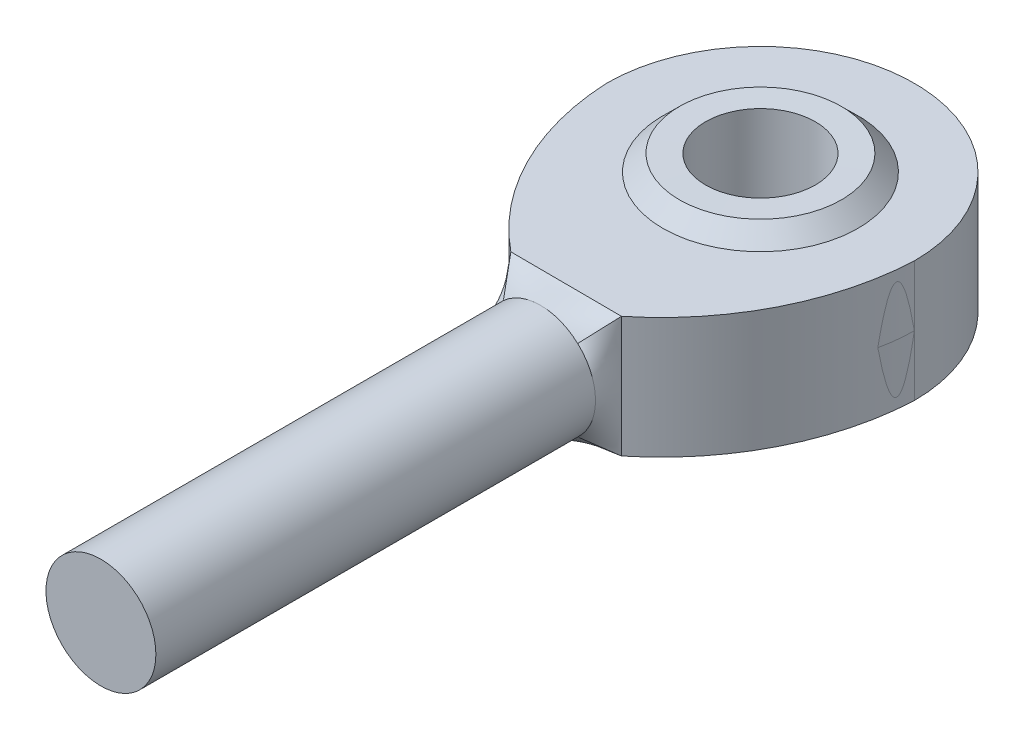
ISO-10303-21;
HEADER;
FILE_DESCRIPTION(('STEP AP214'),'2;1');
FILE_NAME('part.step','',(''),(''),'','','');
FILE_SCHEMA(('AUTOMOTIVE_DESIGN { 1 0 10303 214 1 1 1 1 }'));
ENDSEC;
DATA;
#1=APPLICATION_CONTEXT('core data for automotive mechanical design processes');
#2=APPLICATION_PROTOCOL_DEFINITION('international standard','automotive_design',2000,#1);
#3=PRODUCT_CONTEXT('',#1,'mechanical');
#4=PRODUCT('Part','Part','',(#3));
#5=PRODUCT_RELATED_PRODUCT_CATEGORY('part','',(#4));
#6=PRODUCT_DEFINITION_FORMATION('','',#4);
#7=PRODUCT_DEFINITION_CONTEXT('part definition',#1,'design');
#8=PRODUCT_DEFINITION('design','',#6,#7);
#9=PRODUCT_DEFINITION_SHAPE('','',#8);
#10=(LENGTH_UNIT() NAMED_UNIT(*) SI_UNIT(.MILLI.,.METRE.));
#11=(NAMED_UNIT(*) PLANE_ANGLE_UNIT() SI_UNIT($,.RADIAN.));
#12=(NAMED_UNIT(*) SI_UNIT($,.STERADIAN.) SOLID_ANGLE_UNIT());
#13=UNCERTAINTY_MEASURE_WITH_UNIT(LENGTH_MEASURE(1.E-05),#10,'distance_accuracy_value','');
#14=(GEOMETRIC_REPRESENTATION_CONTEXT(3) GLOBAL_UNCERTAINTY_ASSIGNED_CONTEXT((#13)) GLOBAL_UNIT_ASSIGNED_CONTEXT((#10,
#11,#12)) REPRESENTATION_CONTEXT('',''));
#15=CARTESIAN_POINT('',(0.,0.,0.));
#16=DIRECTION('',(0.,0.,1.));
#17=DIRECTION('',(1.,0.,0.));
#18=AXIS2_PLACEMENT_3D('',#15,#16,#17);
#19=CARTESIAN_POINT('',(0.,-1.16892371536852,0.));
#20=DIRECTION('',(0.,-1.,0.));
#21=DIRECTION('',(0.,0.,-1.));
#22=AXIS2_PLACEMENT_3D('',#19,#20,#21);
#23=CONICAL_SURFACE('',#22,3.92044010300914,1.56325607343749);
#24=CARTESIAN_POINT('',(0.,-1.18345436205042,0.));
#25=DIRECTION('',(0.,1.,0.));
#26=DIRECTION('',(0.,0.,1.));
#27=AXIS2_PLACEMENT_3D('',#24,#25,#26);
#28=CIRCLE('',#27,5.84748029783002);
#29=CARTESIAN_POINT('',(0.,-1.18345436205042,5.84748029783002));
#30=VERTEX_POINT('',#29);
#31=EDGE_CURVE('E372',#30,#30,#28,.T.);
#32=ORIENTED_EDGE('',*,*,#31,.F.);
#33=EDGE_LOOP('',(#32));
#34=FACE_BOUND('',#33,.T.);
#35=CARTESIAN_POINT('',(0.,-1.16924010961895,0.));
#36=DIRECTION('',(0.,-1.,0.));
#37=DIRECTION('',(0.,0.,-1.));
#38=AXIS2_PLACEMENT_3D('',#35,#36,#37);
#39=CIRCLE('',#38,3.9624);
#40=CARTESIAN_POINT('',(0.,-1.16924010961895,-3.9624));
#41=VERTEX_POINT('',#40);
#42=EDGE_CURVE('E164',#41,#41,#39,.T.);
#43=ORIENTED_EDGE('',*,*,#42,.F.);
#44=EDGE_LOOP('',(#43));
#45=FACE_BOUND('',#44,.T.);
#46=ADVANCED_FACE('F62',(#34,#45),#23,.F.);
#47=CARTESIAN_POINT('',(0.,9.90652371536852,0.));
#48=DIRECTION('',(0.,1.,0.));
#49=DIRECTION('',(0.,0.,1.));
#50=AXIS2_PLACEMENT_3D('',#47,#48,#49);
#51=CONICAL_SURFACE('',#50,3.92044010300914,1.56325607343749);
#52=CARTESIAN_POINT('',(0.,9.92105436205042,0.));
#53=DIRECTION('',(0.,1.,0.));
#54=DIRECTION('',(0.,0.,1.));
#55=AXIS2_PLACEMENT_3D('',#52,#53,#54);
#56=CIRCLE('',#55,5.84748029783002);
#57=CARTESIAN_POINT('',(0.,9.92105436205042,5.84748029783002));
#58=VERTEX_POINT('',#57);
#59=EDGE_CURVE('E370',#58,#58,#56,.T.);
#60=ORIENTED_EDGE('',*,*,#59,.T.);
#61=EDGE_LOOP('',(#60));
#62=FACE_BOUND('',#61,.T.);
#63=CARTESIAN_POINT('',(0.,9.90684010961895,0.));
#64=DIRECTION('',(0.,1.,0.));
#65=DIRECTION('',(0.,0.,1.));
#66=AXIS2_PLACEMENT_3D('',#63,#64,#65);
#67=CIRCLE('',#66,3.9624);
#68=CARTESIAN_POINT('',(0.,9.90684010961895,3.9624));
#69=VERTEX_POINT('',#68);
#70=EDGE_CURVE('E162',#69,#69,#67,.T.);
#71=ORIENTED_EDGE('',*,*,#70,.F.);
#72=EDGE_LOOP('',(#71));
#73=FACE_BOUND('',#72,.T.);
#74=ADVANCED_FACE('F316',(#62,#73),#51,.F.);
#75=CARTESIAN_POINT('',(8.02117226566371,8.7376,-0.893156350762035));
#76=DIRECTION('',(0.,-1.,0.));
#77=DIRECTION('',(0.,0.,-1.));
#78=AXIS2_PLACEMENT_3D('',#75,#76,#77);
#79=CYLINDRICAL_SURFACE('',#78,19.1545071102531);
#80=CARTESIAN_POINT('',(-11.1126656469667,4.39084337902803,-0.00355567072469694));
#81=CARTESIAN_POINT('',(-11.1109628571897,4.16544011955918,0.0328834156198211));
#82=CARTESIAN_POINT('',(-11.1091109532948,3.94021175869776,0.0706403665560857));
#83=CARTESIAN_POINT('',(-11.1049320041572,3.4900902433162,0.15038028783108));
#84=CARTESIAN_POINT('',(-11.1026040989611,3.26519844820003,0.19237083606983));
#85=CARTESIAN_POINT('',(-11.0972657560128,2.81356346695619,0.282645473041461));
#86=CARTESIAN_POINT('',(-11.094246615854,2.58683568225523,0.331006142583593));
#87=CARTESIAN_POINT('',(-11.0871996182074,2.13549942637088,0.436578154352732));
#88=CARTESIAN_POINT('',(-11.0831725093641,1.91088951010032,0.493782915840988));
#89=CARTESIAN_POINT('',(-11.0756890965199,1.5784518290188,0.592120601634077));
#90=CARTESIAN_POINT('',(-11.0729650652808,1.46872643297723,0.626858467548423));
#91=CARTESIAN_POINT('',(-11.0667609756059,1.25137174312531,0.702925340154022));
#92=CARTESIAN_POINT('',(-11.0632804546357,1.14374377579289,0.744258375147111));
#93=CARTESIAN_POINT('',(-11.056980501323,0.986238781024577,0.815579542966627));
#94=CARTESIAN_POINT('',(-11.0546949502357,0.934292546728145,0.8409675266039));
#95=CARTESIAN_POINT('',(-11.0495678672902,0.83308774804209,0.896484545370909));
#96=CARTESIAN_POINT('',(-11.0467279039692,0.783822091263936,0.926600159123361));
#97=CARTESIAN_POINT('',(-11.0411711437598,0.70652047212536,0.983738058768479));
#98=CARTESIAN_POINT('',(-11.0387273303208,0.676872005241851,1.0084597848338));
#99=CARTESIAN_POINT('',(-11.0345263297866,0.636601226076233,1.0499562486274));
#100=CARTESIAN_POINT('',(-11.0330268839754,0.623818593302337,1.0646185026043));
#101=CARTESIAN_POINT('',(-11.0298076065915,0.600621912018828,1.09570055808072));
#102=CARTESIAN_POINT('',(-11.0280884700046,0.590200669856196,1.11211479136288));
#103=CARTESIAN_POINT('',(-11.0250942524478,0.576233283117382,1.14031197282098));
#104=CARTESIAN_POINT('',(-11.0238921831743,0.571572051442945,1.15154357350956));
#105=CARTESIAN_POINT('',(-11.0214028305844,0.564104107352884,1.17459851889168));
#106=CARTESIAN_POINT('',(-11.0201156757587,0.561294665833616,1.18642096502725));
#107=CARTESIAN_POINT('',(-11.0174739399878,0.557836953449495,1.21046916186485));
#108=CARTESIAN_POINT('',(-11.0161189390113,0.557204446763719,1.22269720962704));
#109=CARTESIAN_POINT('',(-11.0133956951746,0.558233639729561,1.24705754935722));
#110=CARTESIAN_POINT('',(-11.0120274466596,0.559896366220535,1.25918979602316));
#111=CARTESIAN_POINT('',(-11.0094290725942,0.565083571567715,1.28203963504292));
#112=CARTESIAN_POINT('',(-11.0081965140897,0.568452262838189,1.29279365480291));
#113=CARTESIAN_POINT('',(-11.0057802114308,0.576648655201665,1.31372677760691));
#114=CARTESIAN_POINT('',(-11.0045964850857,0.581476883338956,1.32390567139216));
#115=CARTESIAN_POINT('',(-11.0013431511559,0.596689969626731,1.35169932497154));
#116=CARTESIAN_POINT('',(-10.9993398172252,0.608391995980943,1.3685956393574));
#117=CARTESIAN_POINT('',(-10.9955181482087,0.634159351623868,1.40050566393268));
#118=CARTESIAN_POINT('',(-10.993700552161,0.648233573256542,1.41551190479137));
#119=CARTESIAN_POINT('',(-10.9871672514193,0.703686250124098,1.46899625401694));
#120=CARTESIAN_POINT('',(-10.9829488699916,0.749728165471135,1.50257149659405));
#121=CARTESIAN_POINT('',(-10.9751486981754,0.845729755047151,1.56363783931768));
#122=CARTESIAN_POINT('',(-10.9715718051203,0.895715693428066,1.59108249663131));
#123=CARTESIAN_POINT('',(-10.9611279530207,1.05331404546504,1.67012466215812));
#124=CARTESIAN_POINT('',(-10.9549403930587,1.16417020854714,1.71531622761958));
#125=CARTESIAN_POINT('',(-10.9434118624814,1.38887106700767,1.797814176504));
#126=CARTESIAN_POINT('',(-10.9380735175082,1.50272380949198,1.83509621906608));
#127=CARTESIAN_POINT('',(-10.927935397881,1.73227296933795,1.90464840792196));
#128=CARTESIAN_POINT('',(-10.923136828117,1.84797287786254,1.9369074010318));
#129=CARTESIAN_POINT('',(-10.9139247887446,2.08011069907908,1.99789521226039));
#130=CARTESIAN_POINT('',(-10.9095107866516,2.19654734392982,2.02662893484541));
#131=CARTESIAN_POINT('',(-10.8989042482427,2.48622393656118,2.09474461841743));
#132=CARTESIAN_POINT('',(-10.8928782495136,2.65982981920758,2.13259511638393));
#133=CARTESIAN_POINT('',(-10.8812478754865,3.00795888303966,2.20441788212645));
#134=CARTESIAN_POINT('',(-10.8756437803563,3.18248259285194,2.23838758044571));
#135=CARTESIAN_POINT('',(-10.8648450285006,3.52917957654472,2.30286445245728));
#136=CARTESIAN_POINT('',(-10.8596451210267,3.70134380155574,2.33341972597185));
#137=CARTESIAN_POINT('',(-10.8494965861767,4.04591071196545,2.39224556487585));
#138=CARTESIAN_POINT('',(-10.8445477361554,4.21831304169719,2.42051816825079));
#139=CARTESIAN_POINT('',(-10.8396911446412,4.39084337902787,2.44794736725785));
#140=B_SPLINE_CURVE_WITH_KNOTS('',3,(#80,#81,#82,#83,#84,#85,#86,#87,#88,#89,#90,#91,#92,#93,
#94,#95,#96,#97,#98,#99,#100,#101,#102,#103,#104,#105,#106,#107,#108,#109,#110,#111,#112,#113,
#114,#115,#116,#117,#118,#119,#120,#121,#122,#123,#124,#125,#126,#127,#128,#129,#130,#131,#132,
#133,#134,#135,#136,#137,#138,#139),.UNSPECIFIED.,.F.,.F.,(4,2,2,2,2,2,2,2,2,2,2,2,2,2,2,2,2,2,
2,2,2,2,2,2,2,2,2,2,2,4),(0.,0.685067797743114,1.37138436439667,2.06686932205963,
2.76183924991963,3.10714091601931,3.4526543040292,3.6261118444358,3.79908557255283,
3.91454939725568,3.97293693879883,4.03114414501609,4.06767741531516,4.10415672305035,
4.14089964459015,4.17765900947369,4.21154326225678,4.24543976541776,4.30702694078855,
4.36885033498327,4.53891151583187,4.71022033399248,5.06885701126202,5.42858184597307,
5.78909436148657,6.1490994921276,6.68238148821535,7.21601454587507,7.74079327054086,
8.26509816494794),.UNSPECIFIED.);
#141=CARTESIAN_POINT('',(-11.1125,4.3688,0.));
#142=VERTEX_POINT('',#141);
#143=CARTESIAN_POINT('',(-10.8403117041335,4.36879999999999,2.44444235097204));
#144=VERTEX_POINT('',#143);
#145=EDGE_CURVE('E125',#142,#144,#140,.T.);
#146=ORIENTED_EDGE('',*,*,#145,.F.);
#147=DIRECTION('',(0.,-1.,0.));
#148=VECTOR('',#147,1.);
#149=CARTESIAN_POINT('',(-11.1125,8.7376,0.));
#150=LINE('',#149,#148);
#151=CARTESIAN_POINT('',(-11.1125,0.,0.));
#152=VERTEX_POINT('',#151);
#153=EDGE_CURVE('E120',#142,#152,#150,.T.);
#154=ORIENTED_EDGE('',*,*,#153,.T.);
#155=CARTESIAN_POINT('',(8.02117226566371,0.,-0.893156350762035));
#156=DIRECTION('',(0.,1.,0.));
#157=DIRECTION('',(0.,0.,1.));
#158=AXIS2_PLACEMENT_3D('',#155,#156,#157);
#159=CIRCLE('',#158,19.1545071102531);
#160=CARTESIAN_POINT('',(-4.02183142988038,0.,14.0018496789731));
#161=VERTEX_POINT('',#160);
#162=EDGE_CURVE('E123',#152,#161,#159,.T.);
#163=ORIENTED_EDGE('',*,*,#162,.T.);
#164=DIRECTION('',(0.,-1.,0.));
#165=VECTOR('',#164,1.);
#166=CARTESIAN_POINT('',(-4.02183142988037,8.7376,14.0018496789731));
#167=LINE('',#166,#165);
#168=CARTESIAN_POINT('',(-4.02183142988038,8.7376,14.0018496789731));
#169=VERTEX_POINT('',#168);
#170=EDGE_CURVE('E74',#169,#161,#167,.T.);
#171=ORIENTED_EDGE('',*,*,#170,.F.);
#172=CARTESIAN_POINT('',(8.02117226566371,8.7376,-0.893156350762035));
#173=DIRECTION('',(0.,1.,0.));
#174=DIRECTION('',(0.,0.,1.));
#175=AXIS2_PLACEMENT_3D('',#172,#173,#174);
#176=CIRCLE('',#175,19.1545071102531);
#177=CARTESIAN_POINT('',(-11.1125,8.7376,0.));
#178=VERTEX_POINT('',#177);
#179=EDGE_CURVE('E146',#178,#169,#176,.T.);
#180=ORIENTED_EDGE('',*,*,#179,.F.);
#181=EDGE_CURVE('E128',#178,#142,#150,.T.);
#182=ORIENTED_EDGE('',*,*,#181,.T.);
#183=CARTESIAN_POINT('',(-10.8396911446416,4.34675662097121,2.44794736725399));
#184=CARTESIAN_POINT('',(-10.8460456529828,4.57215988043978,2.4120262490869));
#185=CARTESIAN_POINT('',(-10.8525445933154,4.79738824130089,2.37478674497383));
#186=CARTESIAN_POINT('',(-10.8660085779615,5.24750975668185,2.29608071103563));
#187=CARTESIAN_POINT('',(-10.8729744503136,5.47240155179773,2.25460659975681));
#188=CARTESIAN_POINT('',(-10.8876247850077,5.92403653304159,2.165368851695));
#189=CARTESIAN_POINT('',(-10.8953176037569,6.15076431774287,2.11752859557577));
#190=CARTESIAN_POINT('',(-10.9116661342926,6.60210057362784,2.01299230812434));
#191=CARTESIAN_POINT('',(-10.9203211288061,6.8267104898987,1.95630286102409));
#192=CARTESIAN_POINT('',(-10.9346525822152,7.15914817098052,1.85872770353944));
#193=CARTESIAN_POINT('',(-10.9396366418687,7.26887356702212,1.82424149145619));
#194=CARTESIAN_POINT('',(-10.9503171205177,7.486228256874,1.74867306410372));
#195=CARTESIAN_POINT('',(-10.9560139744229,7.59385622420637,1.70758681745665));
#196=CARTESIAN_POINT('',(-10.9655570138386,7.75136121897473,1.63662676679742));
#197=CARTESIAN_POINT('',(-10.9689120983116,7.8033074532712,1.61135787554528));
#198=CARTESIAN_POINT('',(-10.9761228046884,7.90451225195717,1.55607286794047));
#199=CARTESIAN_POINT('',(-10.9799770043783,7.9537779087352,1.52607018925817));
#200=CARTESIAN_POINT('',(-10.9871251068758,8.03107952787421,1.46910948534284));
#201=CARTESIAN_POINT('',(-10.9901792472364,8.06072799475807,1.44445571909064));
#202=CARTESIAN_POINT('',(-10.9952092187327,8.10099877392382,1.40305156109155));
#203=CARTESIAN_POINT('',(-10.9969717901257,8.1137814066977,1.38841860610932));
#204=CARTESIAN_POINT('',(-11.0006685570512,8.13697808798118,1.35738971902285));
#205=CARTESIAN_POINT('',(-11.0026022056927,8.1473993301438,1.3409993716263));
#206=CARTESIAN_POINT('',(-11.0058839274393,8.1613667168825,1.31283420371723));
#207=CARTESIAN_POINT('',(-11.0071819427174,8.16602794855687,1.30161328660208));
#208=CARTESIAN_POINT('',(-11.0098250137523,8.17349589264686,1.27857545774613));
#209=CARTESIAN_POINT('',(-11.0111699971947,8.17630533416611,1.26675945081849));
#210=CARTESIAN_POINT('',(-11.0138829053268,8.17976304655037,1.24271917901282));
#211=CARTESIAN_POINT('',(-11.015250925563,8.18039555323629,1.23049258094327));
#212=CARTESIAN_POINT('',(-11.0179529848732,8.17936636027043,1.20612988231914));
#213=CARTESIAN_POINT('',(-11.0192870084656,8.1777036337793,1.1939938247131));
#214=CARTESIAN_POINT('',(-11.0217786106631,8.17251642843198,1.17113209666157));
#215=CARTESIAN_POINT('',(-11.0229418289275,8.16914773716152,1.16037035587606));
#216=CARTESIAN_POINT('',(-11.0251894183922,8.16095134479822,1.1394184468827));
#217=CARTESIAN_POINT('',(-11.0262737609345,8.15612311666109,1.12922848672556));
#218=CARTESIAN_POINT('',(-11.029213948113,8.14091003037348,1.10139996430148));
#219=CARTESIAN_POINT('',(-11.0309764050042,8.12920800401904,1.08447682829287));
#220=CARTESIAN_POINT('',(-11.0342676654878,8.1034406483759,1.05250774280563));
#221=CARTESIAN_POINT('',(-11.0357955469703,8.08936642674325,1.03746924227272));
#222=CARTESIAN_POINT('',(-11.0411873482629,8.03391374987573,0.983857787251407));
#223=CARTESIAN_POINT('',(-11.0444579152223,7.98787183452867,0.950177005672653));
#224=CARTESIAN_POINT('',(-11.0502817046972,7.89187024495257,0.888890593066291));
#225=CARTESIAN_POINT('',(-11.0528294884539,7.8418843065716,0.861331344583925));
#226=CARTESIAN_POINT('',(-11.0600285350028,7.68428595453448,0.781927870436947));
#227=CARTESIAN_POINT('',(-11.0639334256974,7.57342979145237,0.736482130088516));
#228=CARTESIAN_POINT('',(-11.0708345384239,7.34872893299175,0.65346891890765));
#229=CARTESIAN_POINT('',(-11.0738279674701,7.23487619050736,0.615925770302413));
#230=CARTESIAN_POINT('',(-11.0792377257773,7.00532703066113,0.54584707910977));
#231=CARTESIAN_POINT('',(-11.0816527770243,6.88962712213636,0.513322681564006));
#232=CARTESIAN_POINT('',(-11.0860820063095,6.65748930091947,0.451802305136305));
#233=CARTESIAN_POINT('',(-11.0880967437527,6.54105265606857,0.422801424785661));
#234=CARTESIAN_POINT('',(-11.0927335652811,6.25137606343713,0.354021014117966));
#235=CARTESIAN_POINT('',(-11.0951812283346,6.07777018079078,0.315772069001075));
#236=CARTESIAN_POINT('',(-11.0996347474038,5.72964111695888,0.243150161515816));
#237=CARTESIAN_POINT('',(-11.1016403115154,5.55511740714672,0.208779767297386));
#238=CARTESIAN_POINT('',(-11.1052891898481,5.20842042345439,0.143506757921775));
#239=CARTESIAN_POINT('',(-11.1069379625612,5.03625619844369,0.112556066074551));
#240=CARTESIAN_POINT('',(-11.109978060724,4.69168928803462,0.0529387037922374));
#241=CARTESIAN_POINT('',(-11.1113696172823,4.51928695830321,0.0242699963140496));
#242=CARTESIAN_POINT('',(-11.1126656469671,4.34675662097286,-0.00355567072844626));
#243=B_SPLINE_CURVE_WITH_KNOTS('',3,(#183,#184,#185,#186,#187,#188,#189,#190,#191,#192,#193,
#194,#195,#196,#197,#198,#199,#200,#201,#202,#203,#204,#205,#206,#207,#208,#209,#210,#211,#212,
#213,#214,#215,#216,#217,#218,#219,#220,#221,#222,#223,#224,#225,#226,#227,#228,#229,#230,#231,
#232,#233,#234,#235,#236,#237,#238,#239,#240,#241,#242),.UNSPECIFIED.,.F.,.F.,(4,2,2,2,2,2,2,2,
2,2,2,2,2,2,2,2,2,2,2,2,2,2,2,2,2,2,2,2,2,4),(0.,0.685067797742172,1.37138436439487,
2.06686932205877,2.76183924991962,3.10714091601943,3.45265430402918,3.6261118444357,
3.79908557255281,3.91454939725594,3.97293693879928,4.03114414501677,4.0676774153159,
4.10415672305113,4.14089964459099,4.17765900947462,4.21154326225768,4.2454397654186,
4.30702694078942,4.36885033498425,4.53891151583306,4.71022033399367,5.06885701126342,
5.42858184597464,5.78909436148867,6.14909949213025,6.6823814882177,7.21601454587712,
7.7407932705419,8.26509816494799),.UNSPECIFIED.);
#244=EDGE_CURVE('E83',#144,#142,#243,.T.);
#245=ORIENTED_EDGE('',*,*,#244,.F.);
#246=EDGE_LOOP('',(#146,#154,#163,#171,#180,#182,#245));
#247=FACE_BOUND('',#246,.T.);
#248=ADVANCED_FACE('F64',(#247),#79,.T.);
#249=CARTESIAN_POINT('',(-8.02219420206442,8.7376,-0.868497150667894));
#250=DIRECTION('',(0.,-1.,0.));
#251=DIRECTION('',(0.,0.,-1.));
#252=AXIS2_PLACEMENT_3D('',#249,#250,#251);
#253=CYLINDRICAL_SURFACE('',#252,19.154394);
#254=CARTESIAN_POINT('',(10.8544062678644,4.39084337902803,2.3818511700385));
#255=CARTESIAN_POINT('',(10.8606389918431,4.16992043596082,2.34559530861078));
#256=CARTESIAN_POINT('',(10.8670147877282,3.9491743761153,2.307996022363));
#257=CARTESIAN_POINT('',(10.8802522442892,3.50780953576342,2.22828777736348));
#258=CARTESIAN_POINT('',(10.8871153531926,3.28719328232629,2.18616516816371));
#259=CARTESIAN_POINT('',(10.9018646532921,2.8357942529453,2.09344036289066));
#260=CARTESIAN_POINT('',(10.9097854971231,2.60507978616454,2.04251099259259));
#261=CARTESIAN_POINT('',(10.926737931113,2.14642954783562,1.93011431941474));
#262=CARTESIAN_POINT('',(10.9357678536056,1.91849015733518,1.86866278465679));
#263=CARTESIAN_POINT('',(10.9509946554952,1.58412237756556,1.76021609391052));
#264=CARTESIAN_POINT('',(10.9562902826518,1.4749655490073,1.72181222921902));
#265=CARTESIAN_POINT('',(10.9678137515461,1.26095720569821,1.63597694412559));
#266=CARTESIAN_POINT('',(10.9740359503972,1.15608421550823,1.58859972738118));
#267=CARTESIAN_POINT('',(10.9859441183205,0.992818711068162,1.49432199060504));
#268=CARTESIAN_POINT('',(10.9909999137069,0.931409625070102,1.45353329203082));
#269=CARTESIAN_POINT('',(10.9983774697741,0.865129323285589,1.39176735809753));
#270=CARTESIAN_POINT('',(10.9998691844562,0.852667812659613,1.37918800776412));
#271=CARTESIAN_POINT('',(11.0029834322508,0.829257350190521,1.35267534522897));
#272=CARTESIAN_POINT('',(11.0046059654107,0.818308398895334,1.33874203253676));
#273=CARTESIAN_POINT('',(11.007668609273,0.800552712465605,1.31216172429249));
#274=CARTESIAN_POINT('',(11.0090842735302,0.793354252252338,1.29977824305076));
#275=CARTESIAN_POINT('',(11.0120007471118,0.781038671561248,1.27402447954094));
#276=CARTESIAN_POINT('',(11.0135013478884,0.775916685440925,1.26065659191549));
#277=CARTESIAN_POINT('',(11.0162504794611,0.769130951960259,1.2359163145523));
#278=CARTESIAN_POINT('',(11.0174895505454,0.766981046917844,1.22467809345633));
#279=CARTESIAN_POINT('',(11.0199690376071,0.764647523062337,1.20199998496837));
#280=CARTESIAN_POINT('',(11.0212094520282,0.764462523996486,1.19056024479284));
#281=CARTESIAN_POINT('',(11.0236529721966,0.766078446505053,1.16783424658813));
#282=CARTESIAN_POINT('',(11.0248561151917,0.767877315006459,1.15654784210048));
#283=CARTESIAN_POINT('',(11.027197776711,0.77325593776097,1.13440055913899));
#284=CARTESIAN_POINT('',(11.0283362170676,0.776837797152826,1.12354020007869));
#285=CARTESIAN_POINT('',(11.0310565477915,0.787520480119634,1.09738470535022));
#286=CARTESIAN_POINT('',(11.0325914009999,0.795484796972392,1.08244093649872));
#287=CARTESIAN_POINT('',(11.0354872015443,0.813614634535032,1.05394786965855));
#288=CARTESIAN_POINT('',(11.0368476858445,0.823785830531355,1.04040230240067));
#289=CARTESIAN_POINT('',(11.0406082924977,0.855648197719601,1.00259936073501));
#290=CARTESIAN_POINT('',(11.042808069999,0.879302756810653,0.980003539197024));
#291=CARTESIAN_POINT('',(11.0468282703172,0.929345140987467,0.938052736000902));
#292=CARTESIAN_POINT('',(11.0486471933911,0.955743181142737,0.918710623560798));
#293=CARTESIAN_POINT('',(11.0565577329556,1.08212627909994,0.83347656655539));
#294=CARTESIAN_POINT('',(11.0611227393145,1.1907985816696,0.780848557735418));
#295=CARTESIAN_POINT('',(11.0690550526455,1.41311324658526,0.686174561895312));
#296=CARTESIAN_POINT('',(11.0724083209329,1.52679774263928,0.644254163992803));
#297=CARTESIAN_POINT('',(11.0783866801136,1.75728858742897,0.566836217861828));
#298=CARTESIAN_POINT('',(11.0810070948351,1.87410999385303,0.53138039652259));
#299=CARTESIAN_POINT('',(11.0857713436944,2.1089872012615,0.464749248254735));
#300=CARTESIAN_POINT('',(11.0879148315392,2.22704383443592,0.433577037864059));
#301=CARTESIAN_POINT('',(11.0938476179149,2.58282049844717,0.34449843770762));
#302=CARTESIAN_POINT('',(11.097129105851,2.8217001625673,0.291166739072201));
#303=CARTESIAN_POINT('',(11.1026804366495,3.28239905641647,0.195481010276711));
#304=CARTESIAN_POINT('',(11.1050087835174,3.50411315085117,0.152597558322424));
#305=CARTESIAN_POINT('',(11.1091638578706,3.94742758058687,0.0714653324851663));
#306=CARTESIAN_POINT('',(11.1109926680557,4.16902442079553,0.033197698968867));
#307=CARTESIAN_POINT('',(11.112665614241,4.39084337902803,-0.00365651935106436));
#308=B_SPLINE_CURVE_WITH_KNOTS('',3,(#254,#255,#256,#257,#258,#259,#260,#261,#262,#263,#264,
#265,#266,#267,#268,#269,#270,#271,#272,#273,#274,#275,#276,#277,#278,#279,#280,#281,#282,#283,
#284,#285,#286,#287,#288,#289,#290,#291,#292,#293,#294,#295,#296,#297,#298,#299,#300,#301,#302,
#303,#304,#305,#306,#307),.UNSPECIFIED.,.F.,.F.,(4,2,2,2,2,2,2,2,2,2,2,2,2,2,2,2,2,2,2,2,2,2,2,
2,2,2,4),(0.,0.671968043743998,1.3460241842387,2.05515349232718,2.76322928025431,
3.11047287844774,3.45568223707197,3.67515374298682,3.72837423321053,3.78159474271347,
3.82463828073016,3.86758036690587,3.90195261079969,3.93630070823291,3.97061329269389,
4.00496648571401,4.05568124148393,4.10652799639551,4.20433719945883,4.30252460205514,
4.66228972329274,5.02609855239453,5.39217838804841,5.75852317042159,6.49261395156116,
7.17008792176553,7.84469264758675),.UNSPECIFIED.);
#309=CARTESIAN_POINT('',(10.8550270415765,4.3688,2.37824392706928));
#310=VERTEX_POINT('',#309);
#311=CARTESIAN_POINT('',(11.1125,4.3688,0.));
#312=VERTEX_POINT('',#311);
#313=EDGE_CURVE('E343',#310,#312,#308,.T.);
#314=ORIENTED_EDGE('',*,*,#313,.F.);
#315=CARTESIAN_POINT('',(11.112665614241,4.34675662097196,-0.00365651935103501));
#316=CARTESIAN_POINT('',(11.1109946225713,4.56767956403924,0.0330932034084665));
#317=CARTESIAN_POINT('',(11.1091758745455,4.78842562388482,0.0711858438410958));
#318=CARTESIAN_POINT('',(11.105047847488,5.22979046423681,0.151880292037523));
#319=CARTESIAN_POINT('',(11.1027370617255,5.45040671767398,0.194495743915671));
#320=CARTESIAN_POINT('',(11.0973001075203,5.90180574705495,0.288228720478462));
#321=CARTESIAN_POINT('',(11.0941377685648,6.13252021383565,0.339673255059691));
#322=CARTESIAN_POINT('',(11.0866428235905,6.59117045216445,0.453093812982242));
#323=CARTESIAN_POINT('',(11.0823119631624,6.81910984266482,0.515054076637961));
#324=CARTESIAN_POINT('',(11.0739767247004,7.15347762243446,0.6242468604167));
#325=CARTESIAN_POINT('',(11.0709306430814,7.26263445099275,0.662894264947806));
#326=CARTESIAN_POINT('',(11.0638170611654,7.47664279430177,0.749206972324987));
#327=CARTESIAN_POINT('',(11.0597556491324,7.58151578449166,0.796818119730931));
#328=CARTESIAN_POINT('',(11.0512110398974,7.74478128893171,0.891460001411113));
#329=CARTESIAN_POINT('',(11.0474202926271,7.8061903749298,0.932385656366178));
#330=CARTESIAN_POINT('',(11.0414080643556,7.87247067671432,0.994299403138645));
#331=CARTESIAN_POINT('',(11.040173044304,7.88493218734035,1.00690654369381));
#332=CARTESIAN_POINT('',(11.037541023189,7.90834264980949,1.03347141295548));
#333=CARTESIAN_POINT('',(11.0361440220671,7.91929160110469,1.04742914215124));
#334=CARTESIAN_POINT('',(11.0334471154558,7.93704728753437,1.07404904576708));
#335=CARTESIAN_POINT('',(11.0321797260056,7.94424574774759,1.08644857950557));
#336=CARTESIAN_POINT('',(11.0295169289687,7.9565613284388,1.11222980649344));
#337=CARTESIAN_POINT('',(11.0281218301562,7.9616833145593,1.12560911595086));
#338=CARTESIAN_POINT('',(11.0255124698115,7.96846904803968,1.15036452519811));
#339=CARTESIAN_POINT('',(11.0243176818749,7.97061895308176,1.1616075404672));
#340=CARTESIAN_POINT('',(11.021886260081,7.97295247693761,1.18429085258736));
#341=CARTESIAN_POINT('',(11.02064965621,7.97313747600416,1.19573100529987));
#342=CARTESIAN_POINT('',(11.0181728517364,7.97152155349571,1.21845340008583));
#343=CARTESIAN_POINT('',(11.0169326561743,7.96972268499372,1.22973579319599));
#344=CARTESIAN_POINT('',(11.0144802069424,7.96434406223891,1.25187108208079));
#345=CARTESIAN_POINT('',(11.0132679880785,7.96076220284733,1.2627234537475));
#346=CARTESIAN_POINT('',(11.0103276161615,7.95007951988069,1.28885512642131));
#347=CARTESIAN_POINT('',(11.008628713625,7.94211520302757,1.30378113499784));
#348=CARTESIAN_POINT('',(11.0053594699841,7.92398536546462,1.33223377221767));
#349=CARTESIAN_POINT('',(11.0037894750054,7.91381416946836,1.3457566574733));
#350=CARTESIAN_POINT('',(10.999372545464,7.88195180228011,1.38348854444452));
#351=CARTESIAN_POINT('',(10.996685505546,7.85829724318885,1.40603161407818));
#352=CARTESIAN_POINT('',(10.9916344495487,7.80825485901185,1.44787081498738));
#353=CARTESIAN_POINT('',(10.9892717226831,7.7818568188566,1.46715405425259));
#354=CARTESIAN_POINT('',(10.9787575937681,7.65547372089915,1.55210624200001));
#355=CARTESIAN_POINT('',(10.9719536365219,7.54680141832871,1.60449185797599));
#356=CARTESIAN_POINT('',(10.9594404864704,7.32448675341178,1.69866992420651));
#357=CARTESIAN_POINT('',(10.9537444582323,7.21080225735727,1.74033669070989));
#358=CARTESIAN_POINT('',(10.9430156834597,6.98031141256713,1.817240348318));
#359=CARTESIAN_POINT('',(10.9379872992872,6.86349000614312,1.85243547855991));
#360=CARTESIAN_POINT('',(10.9283810834473,6.62861279873486,1.91854242678693));
#361=CARTESIAN_POINT('',(10.9238035804968,6.5105561655606,1.94945112633126));
#362=CARTESIAN_POINT('',(10.9105347316048,6.15477950154975,2.0377355111855));
#363=CARTESIAN_POINT('',(10.9023263943164,5.91589983742983,2.09053382026218));
#364=CARTESIAN_POINT('',(10.8872709020797,5.4552009435813,2.18519061147243));
#365=CARTESIAN_POINT('',(10.8803675913063,5.23348684914702,2.22757876961843));
#366=CARTESIAN_POINT('',(10.8670628642942,4.79017241941221,2.30772043762762));
#367=CARTESIAN_POINT('',(10.8606594462514,4.56857557920402,2.34549281588207));
#368=CARTESIAN_POINT('',(10.8544062678644,4.34675662097198,2.38185117003857));
#369=B_SPLINE_CURVE_WITH_KNOTS('',3,(#315,#316,#317,#318,#319,#320,#321,#322,#323,#324,#325,
#326,#327,#328,#329,#330,#331,#332,#333,#334,#335,#336,#337,#338,#339,#340,#341,#342,#343,#344,
#345,#346,#347,#348,#349,#350,#351,#352,#353,#354,#355,#356,#357,#358,#359,#360,#361,#362,#363,
#364,#365,#366,#367,#368),.UNSPECIFIED.,.F.,.F.,(4,2,2,2,2,2,2,2,2,2,2,2,2,2,2,2,2,2,2,2,2,2,2,
2,2,2,4),(0.,0.671968043744191,1.34602418423903,2.05515349232732,2.7632292802543,
3.11047287844774,3.45568223707202,3.67515374298692,3.72837423321091,3.7815947427141,
3.82463828073047,3.8675803669059,3.90195261079971,3.93630070823284,3.97061329269385,
4.00496648571406,4.05568124148407,4.10652799639571,4.20433719945929,4.30252460205588,
4.66228972329509,5.02609855239865,5.39217838805209,5.75852317042486,6.4926139515637,
7.17008792176677,7.84469264758659),.UNSPECIFIED.);
#370=EDGE_CURVE('E160',#312,#310,#369,.T.);
#371=ORIENTED_EDGE('',*,*,#370,.F.);
#372=DIRECTION('',(0.,-1.,0.));
#373=VECTOR('',#372,1.);
#374=CARTESIAN_POINT('',(11.1125,8.7376,0.));
#375=LINE('',#374,#373);
#376=CARTESIAN_POINT('',(11.1125,8.7376,0.));
#377=VERTEX_POINT('',#376);
#378=EDGE_CURVE('E154',#377,#312,#375,.T.);
#379=ORIENTED_EDGE('',*,*,#378,.F.);
#380=CARTESIAN_POINT('',(-8.02219420206442,8.7376,-0.868497150667894));
#381=DIRECTION('',(0.,1.,0.));
#382=DIRECTION('',(0.,0.,1.));
#383=AXIS2_PLACEMENT_3D('',#380,#381,#382);
#384=CIRCLE('',#383,19.154394);
#385=CARTESIAN_POINT('',(4.00153659565176,8.7376,14.0419256203768));
#386=VERTEX_POINT('',#385);
#387=EDGE_CURVE('E108',#386,#377,#384,.T.);
#388=ORIENTED_EDGE('',*,*,#387,.F.);
#389=DIRECTION('',(0.,-1.,0.));
#390=VECTOR('',#389,1.);
#391=CARTESIAN_POINT('',(4.00153659565176,8.7376,14.0419256203768));
#392=LINE('',#391,#390);
#393=CARTESIAN_POINT('',(4.00153659565175,0.,14.0419256203768));
#394=VERTEX_POINT('',#393);
#395=EDGE_CURVE('E155',#386,#394,#392,.T.);
#396=ORIENTED_EDGE('',*,*,#395,.T.);
#397=CARTESIAN_POINT('',(-8.02219420206442,0.,-0.868497150667894));
#398=DIRECTION('',(0.,1.,0.));
#399=DIRECTION('',(0.,0.,1.));
#400=AXIS2_PLACEMENT_3D('',#397,#398,#399);
#401=CIRCLE('',#400,19.154394);
#402=CARTESIAN_POINT('',(11.1125,0.,0.));
#403=VERTEX_POINT('',#402);
#404=EDGE_CURVE('E147',#394,#403,#401,.T.);
#405=ORIENTED_EDGE('',*,*,#404,.T.);
#406=EDGE_CURVE('E144',#312,#403,#375,.T.);
#407=ORIENTED_EDGE('',*,*,#406,.F.);
#408=EDGE_LOOP('',(#314,#371,#379,#388,#396,#405,#407));
#409=FACE_BOUND('',#408,.T.);
#410=ADVANCED_FACE('F351',(#409),#253,.T.);
#411=CARTESIAN_POINT('',(8.02117226566371,8.7376,-0.893156350762035));
#412=DIRECTION('',(0.,1.,0.));
#413=DIRECTION('',(0.,0.,1.));
#414=AXIS2_PLACEMENT_3D('',#411,#412,#413);
#415=PLANE('',#414);
#416=ORIENTED_EDGE('',*,*,#179,.T.);
#417=DIRECTION('',(0.999987525707678,0.,0.00499484024129538));
#418=VECTOR('',#417,1.);
#419=CARTESIAN_POINT('',(-4.02183142988038,8.7376,14.0018496789731));
#420=LINE('',#419,#418);
#421=EDGE_CURVE('E104',#169,#386,#420,.T.);
#422=ORIENTED_EDGE('',*,*,#421,.T.);
#423=ORIENTED_EDGE('',*,*,#387,.T.);
#424=CARTESIAN_POINT('',(0.,8.7376,0.));
#425=DIRECTION('',(0.,-1.,0.));
#426=DIRECTION('',(0.,0.,-1.));
#427=AXIS2_PLACEMENT_3D('',#424,#425,#426);
#428=CIRCLE('',#427,11.1125);
#429=EDGE_CURVE('E129',#178,#377,#428,.T.);
#430=ORIENTED_EDGE('',*,*,#429,.F.);
#431=EDGE_LOOP('',(#416,#422,#423,#430));
#432=FACE_BOUND('',#431,.T.);
#433=CARTESIAN_POINT('',(0.,8.7376,0.));
#434=DIRECTION('',(0.,1.,0.));
#435=DIRECTION('',(0.,0.,1.));
#436=AXIS2_PLACEMENT_3D('',#433,#434,#435);
#437=CIRCLE('',#436,7.04891768873992);
#438=CARTESIAN_POINT('',(0.,8.7376,7.04891768873992));
#439=VERTEX_POINT('',#438);
#440=EDGE_CURVE('E157',#439,#439,#437,.F.);
#441=ORIENTED_EDGE('',*,*,#440,.T.);
#442=EDGE_LOOP('',(#441));
#443=FACE_BOUND('',#442,.T.);
#444=ADVANCED_FACE('F355',(#432,#443),#415,.T.);
#445=CARTESIAN_POINT('',(8.02117226566371,0.,-0.893156350762035));
#446=DIRECTION('',(0.,1.,0.));
#447=DIRECTION('',(0.,0.,1.));
#448=AXIS2_PLACEMENT_3D('',#445,#446,#447);
#449=PLANE('',#448);
#450=ORIENTED_EDGE('',*,*,#162,.F.);
#451=CARTESIAN_POINT('',(0.,0.,0.));
#452=DIRECTION('',(0.,-1.,0.));
#453=DIRECTION('',(0.,0.,-1.));
#454=AXIS2_PLACEMENT_3D('',#451,#452,#453);
#455=CIRCLE('',#454,11.1125);
#456=EDGE_CURVE('E136',#152,#403,#455,.T.);
#457=ORIENTED_EDGE('',*,*,#456,.T.);
#458=ORIENTED_EDGE('',*,*,#404,.F.);
#459=DIRECTION('',(-0.999987525707678,0.,-0.00499484024129538));
#460=VECTOR('',#459,1.);
#461=CARTESIAN_POINT('',(4.00153659565175,0.,14.0419256203768));
#462=LINE('',#461,#460);
#463=EDGE_CURVE('E138',#161,#394,#462,.F.);
#464=ORIENTED_EDGE('',*,*,#463,.F.);
#465=EDGE_LOOP('',(#450,#457,#458,#464));
#466=FACE_BOUND('',#465,.T.);
#467=CARTESIAN_POINT('',(0.,0.,0.));
#468=DIRECTION('',(0.,1.,0.));
#469=DIRECTION('',(0.,0.,1.));
#470=AXIS2_PLACEMENT_3D('',#467,#468,#469);
#471=CIRCLE('',#470,7.04891768873992);
#472=CARTESIAN_POINT('',(0.,0.,7.04891768873992));
#473=VERTEX_POINT('',#472);
#474=EDGE_CURVE('E12',#473,#473,#471,.F.);
#475=ORIENTED_EDGE('',*,*,#474,.F.);
#476=EDGE_LOOP('',(#475));
#477=FACE_BOUND('',#476,.T.);
#478=ADVANCED_FACE('F133',(#466,#477),#449,.F.);
#479=CARTESIAN_POINT('',(0.,8.7376,0.));
#480=DIRECTION('',(0.,-1.,0.));
#481=DIRECTION('',(0.,0.,-1.));
#482=AXIS2_PLACEMENT_3D('',#479,#480,#481);
#483=CYLINDRICAL_SURFACE('',#482,11.1125);
#484=ORIENTED_EDGE('',*,*,#153,.F.);
#485=ORIENTED_EDGE('',*,*,#181,.F.);
#486=ORIENTED_EDGE('',*,*,#429,.T.);
#487=ORIENTED_EDGE('',*,*,#378,.T.);
#488=ORIENTED_EDGE('',*,*,#406,.T.);
#489=ORIENTED_EDGE('',*,*,#456,.F.);
#490=EDGE_LOOP('',(#484,#485,#486,#487,#488,#489));
#491=FACE_BOUND('',#490,.T.);
#492=ADVANCED_FACE('F141',(#491),#483,.T.);
#493=CARTESIAN_POINT('',(0.,-1.18345436205042,0.));
#494=DIRECTION('',(0.,1.,0.));
#495=DIRECTION('',(0.,0.,1.));
#496=AXIS2_PLACEMENT_3D('',#493,#494,#495);
#497=CONICAL_SURFACE('',#496,5.84748029783002,0.792938416754851);
#498=ORIENTED_EDGE('',*,*,#31,.T.);
#499=EDGE_LOOP('',(#498));
#500=FACE_BOUND('',#499,.T.);
#501=ORIENTED_EDGE('',*,*,#474,.T.);
#502=EDGE_LOOP('',(#501));
#503=FACE_BOUND('',#502,.T.);
#504=ADVANCED_FACE('F309',(#500,#503),#497,.T.);
#505=CARTESIAN_POINT('',(0.,8.70731500792162,0.));
#506=DIRECTION('',(0.,-1.,0.));
#507=DIRECTION('',(0.,0.,-1.));
#508=AXIS2_PLACEMENT_3D('',#505,#506,#507);
#509=CONICAL_SURFACE('',#508,7.07966287252828,0.792938416754851);
#510=ORIENTED_EDGE('',*,*,#440,.F.);
#511=EDGE_LOOP('',(#510));
#512=FACE_BOUND('',#511,.T.);
#513=ORIENTED_EDGE('',*,*,#59,.F.);
#514=EDGE_LOOP('',(#513));
#515=FACE_BOUND('',#514,.T.);
#516=ADVANCED_FACE('F312',(#512,#515),#509,.T.);
#517=CARTESIAN_POINT('',(0.,4.3688,0.));
#518=DIRECTION('',(0.,-1.,0.));
#519=DIRECTION('',(0.,0.,-1.));
#520=AXIS2_PLACEMENT_3D('',#517,#518,#519);
#521=CONICAL_SURFACE('',#520,11.1125,0.00754025335740361);
#522=CARTESIAN_POINT('',(0.,4.3688,0.));
#523=DIRECTION('',(0.,1.,0.));
#524=DIRECTION('',(0.,0.,1.));
#525=AXIS2_PLACEMENT_3D('',#522,#523,#524);
#526=CIRCLE('',#525,11.1125);
#527=EDGE_CURVE('E161',#310,#312,#526,.T.);
#528=ORIENTED_EDGE('',*,*,#527,.T.);
#529=ORIENTED_EDGE('',*,*,#370,.T.);
#530=EDGE_LOOP('',(#528,#529));
#531=FACE_BOUND('',#530,.T.);
#532=ADVANCED_FACE('F323',(#531),#521,.T.);
#533=CARTESIAN_POINT('',(0.,0.000124194392535706,0.));
#534=DIRECTION('',(0.,1.,0.));
#535=DIRECTION('',(0.,0.,1.));
#536=AXIS2_PLACEMENT_3D('',#533,#534,#535);
#537=CONICAL_SURFACE('',#536,11.0795584532852,0.00754025335740361);
#538=ORIENTED_EDGE('',*,*,#527,.F.);
#539=ORIENTED_EDGE('',*,*,#313,.T.);
#540=EDGE_LOOP('',(#538,#539));
#541=FACE_BOUND('',#540,.T.);
#542=ADVANCED_FACE('F381',(#541),#537,.T.);
#543=EDGE_CURVE('E371',#142,#144,#526,.T.);
#544=ORIENTED_EDGE('',*,*,#543,.F.);
#545=ORIENTED_EDGE('',*,*,#145,.T.);
#546=EDGE_LOOP('',(#544,#545));
#547=FACE_BOUND('',#546,.T.);
#548=ADVANCED_FACE('F328',(#547),#537,.T.);
#549=ORIENTED_EDGE('',*,*,#543,.T.);
#550=ORIENTED_EDGE('',*,*,#244,.T.);
#551=EDGE_LOOP('',(#549,#550));
#552=FACE_BOUND('',#551,.T.);
#553=ADVANCED_FACE('F307',(#552),#521,.T.);
#554=CARTESIAN_POINT('',(0.,21.082,0.));
#555=DIRECTION('',(0.,-1.,0.));
#556=DIRECTION('',(0.,0.,-1.));
#557=AXIS2_PLACEMENT_3D('',#554,#555,#556);
#558=CYLINDRICAL_SURFACE('',#557,3.9624);
#559=ORIENTED_EDGE('',*,*,#70,.T.);
#560=EDGE_LOOP('',(#559));
#561=FACE_BOUND('',#560,.T.);
#562=ORIENTED_EDGE('',*,*,#42,.T.);
#563=EDGE_LOOP('',(#562));
#564=FACE_BOUND('',#563,.T.);
#565=ADVANCED_FACE('F253',(#561,#564),#558,.F.);
#566=CARTESIAN_POINT('',(-4.02183142988038,0.,14.0018496789731));
#567=CARTESIAN_POINT('',(-2.68938208528696,1.44553725075589,15.875762));
#568=CARTESIAN_POINT('',(-3.35321742775271,0.,14.0051893407568));
#569=CARTESIAN_POINT('',(-2.35985185178866,1.142943593585,15.875762));
#570=CARTESIAN_POINT('',(-2.68460342562503,0.,14.0085290025404));
#571=CARTESIAN_POINT('',(-1.95449530447948,0.876355380839149,15.875762));
#572=CARTESIAN_POINT('',(-1.34737542136968,0.,14.0152083261077));
#573=CARTESIAN_POINT('',(-1.03419989736836,0.503788581639526,15.875762));
#574=CARTESIAN_POINT('',(-0.678761419242002,0.,14.0185479878913));
#575=CARTESIAN_POINT('',(-0.52032468374409,0.400049999999999,15.875762));
#576=CARTESIAN_POINT('',(0.658466585013353,0.,14.0252273114586));
#577=CARTESIAN_POINT('',(0.510177266629776,0.400049999999999,15.875762));
#578=CARTESIAN_POINT('',(1.32708058714103,0.,14.0285669732422));
#579=CARTESIAN_POINT('',(1.02405248025405,0.503788581639525,15.875762));
#580=CARTESIAN_POINT('',(2.66430859139639,0.,14.0352462968095));
#581=CARTESIAN_POINT('',(1.94434788736517,0.876355380839148,15.875762));
#582=CARTESIAN_POINT('',(3.33292259352407,0.,14.0385859585931));
#583=CARTESIAN_POINT('',(2.34970443467435,1.142943593585,15.875762));
#584=CARTESIAN_POINT('',(4.00153659565175,0.,14.0419256203768));
#585=CARTESIAN_POINT('',(2.67923466817265,1.44553725075589,15.875762));
#586=B_SPLINE_SURFACE_WITH_KNOTS('',3,1,((#566,#567),(#568,#569),(#570,#571),(#572,#573),(#574,
#575),(#576,#577),(#578,#579),(#580,#581),(#582,#583),(#584,#585)),.UNSPECIFIED.,.F.,.F.,.F.,(4,
2,2,2,4),(2,2),(0.,0.25,0.5,0.75,1.),(0.,1.),.UNSPECIFIED.);
#587=DIRECTION('',(-0.492758060404251,0.538681913050317,0.683382243300988));
#588=VECTOR('',#587,1.);
#589=CARTESIAN_POINT('',(3.3403856319122,0.722768625377946,14.9588438101884));
#590=LINE('',#589,#588);
#591=CARTESIAN_POINT('',(2.67927962287358,1.4454885352463,15.875762));
#592=VERTEX_POINT('',#591);
#593=EDGE_CURVE('E165',#394,#592,#590,.T.);
#594=CARTESIAN_POINT('',(-0.00507370855715606,4.3688,15.875762));
#595=DIRECTION('',(0.,0.,1.));
#596=DIRECTION('',(1.,0.,0.));
#597=AXIS2_PLACEMENT_3D('',#594,#595,#596);
#598=CIRCLE('',#597,3.96875);
#599=CARTESIAN_POINT('',(-2.68941168057928,1.44550515832391,15.875762));
#600=VERTEX_POINT('',#599);
#601=EDGE_CURVE('E174',#600,#592,#598,.T.);
#602=DIRECTION('',(-0.490596180576867,-0.532234157328375,-0.68995810697197));
#603=VECTOR('',#602,1.);
#604=CARTESIAN_POINT('',(-3.35560675758367,0.722768625377946,14.9388058394866));
#605=LINE('',#604,#603);
#606=EDGE_CURVE('E222',#600,#161,#605,.T.);
#607=ORIENTED_EDGE('',*,*,#463,.T.);
#608=ORIENTED_EDGE('',*,*,#593,.T.);
#609=ORIENTED_EDGE('',*,*,#601,.F.);
#610=ORIENTED_EDGE('',*,*,#606,.T.);
#611=EDGE_LOOP('',(#607,#608,#609,#610));
#612=FACE_BOUND('',#611,.T.);
#613=ADVANCED_FACE('F241',(#612),#586,.T.);
#614=CARTESIAN_POINT('',(4.00153659565176,0.,14.0419256203768));
#615=CARTESIAN_POINT('',(2.67923466817265,1.44553725075589,15.875762));
#616=CARTESIAN_POINT('',(4.00153659565176,0.728133333333334,14.0419256203768));
#617=CARTESIAN_POINT('',(3.03809934433509,1.77506748425419,15.875762));
#618=CARTESIAN_POINT('',(4.00153659565176,1.45626666666667,14.0419256203768));
#619=CARTESIAN_POINT('',(3.36578615997473,2.20182987300996,15.875762));
#620=CARTESIAN_POINT('',(4.00153659565176,2.54846666666667,14.0419256203768));
#621=CARTESIAN_POINT('',(3.71442401804271,2.95699865780275,15.875762));
#622=CARTESIAN_POINT('',(4.00153659565176,2.91253333333334,14.0419256203768));
#623=CARTESIAN_POINT('',(3.80670490240187,3.22696491170179,15.875762));
#624=CARTESIAN_POINT('',(4.00153659565176,3.64066666666667,14.0419256203768));
#625=CARTESIAN_POINT('',(3.93137939991421,3.78761115578516,15.875762));
#626=CARTESIAN_POINT('',(4.00153659565176,4.00473333333334,14.0419256203768));
#627=CARTESIAN_POINT('',(3.96367629144284,4.07816426579788,15.875762));
#628=CARTESIAN_POINT('',(4.00153659565176,4.73286666666667,14.0419256203768));
#629=CARTESIAN_POINT('',(3.96367629144284,4.65943573420212,15.875762));
#630=CARTESIAN_POINT('',(4.00153659565176,5.09693333333334,14.0419256203768));
#631=CARTESIAN_POINT('',(3.93137939991421,4.94998884421484,15.875762));
#632=CARTESIAN_POINT('',(4.00153659565176,5.82506666666667,14.0419256203768));
#633=CARTESIAN_POINT('',(3.80670490240187,5.51063508829821,15.875762));
#634=CARTESIAN_POINT('',(4.00153659565176,6.18913333333334,14.0419256203768));
#635=CARTESIAN_POINT('',(3.71442401804271,5.78060134219725,15.875762));
#636=CARTESIAN_POINT('',(4.00153659565176,7.28133333333333,14.0419256203768));
#637=CARTESIAN_POINT('',(3.36578615997474,6.53577012699004,15.875762));
#638=CARTESIAN_POINT('',(4.00153659565176,8.00946666666667,14.0419256203768));
#639=CARTESIAN_POINT('',(3.03809934433509,6.96253251574581,15.875762));
#640=CARTESIAN_POINT('',(4.00153659565176,8.7376,14.0419256203768));
#641=CARTESIAN_POINT('',(2.67923466817265,7.29206274924411,15.875762));
#642=B_SPLINE_SURFACE_WITH_KNOTS('',3,1,((#614,#615),(#616,#617),(#618,#619),(#620,#621),(#622,
#623),(#624,#625),(#626,#627),(#628,#629),(#630,#631),(#632,#633),(#634,#635),(#636,#637),(#638,
#639),(#640,#641)),.UNSPECIFIED.,.F.,.F.,.F.,(4,2,2,2,2,2,4),(2,2),(0.,0.25,0.375,0.5,0.625,
0.75,1.),(0.,1.),.UNSPECIFIED.);
#643=DIRECTION('',(-0.492758060404252,-0.538681913050317,0.683382243300988));
#644=VECTOR('',#643,1.);
#645=CARTESIAN_POINT('',(3.3403856319122,8.01483137462205,14.9588438101884));
#646=LINE('',#645,#644);
#647=CARTESIAN_POINT('',(2.67926426346498,7.2920948416761,15.875762));
#648=VERTEX_POINT('',#647);
#649=EDGE_CURVE('E198',#386,#648,#646,.T.);
#650=EDGE_CURVE('E190',#592,#648,#598,.T.);
#651=ORIENTED_EDGE('',*,*,#395,.F.);
#652=ORIENTED_EDGE('',*,*,#649,.T.);
#653=ORIENTED_EDGE('',*,*,#650,.F.);
#654=ORIENTED_EDGE('',*,*,#593,.F.);
#655=EDGE_LOOP('',(#651,#652,#653,#654));
#656=FACE_BOUND('',#655,.T.);
#657=ADVANCED_FACE('F252',(#656),#642,.T.);
#658=CARTESIAN_POINT('',(-4.02183142988038,8.7376,14.0018496789731));
#659=CARTESIAN_POINT('',(-2.68938208528696,7.29206274924411,15.875762));
#660=CARTESIAN_POINT('',(-4.02183142988038,8.00946666666667,14.0018496789731));
#661=CARTESIAN_POINT('',(-3.0482467614494,6.96253251574581,15.875762));
#662=CARTESIAN_POINT('',(-4.02183142988038,7.28133333333334,14.0018496789731));
#663=CARTESIAN_POINT('',(-3.37593357708905,6.53577012699004,15.875762));
#664=CARTESIAN_POINT('',(-4.02183142988038,6.18913333333334,14.0018496789731));
#665=CARTESIAN_POINT('',(-3.72457143515702,5.78060134219725,15.875762));
#666=CARTESIAN_POINT('',(-4.02183142988038,5.82506666666667,14.0018496789731));
#667=CARTESIAN_POINT('',(-3.81685231951618,5.51063508829821,15.875762));
#668=CARTESIAN_POINT('',(-4.02183142988038,5.09693333333334,14.0018496789731));
#669=CARTESIAN_POINT('',(-3.94152681702853,4.94998884421484,15.875762));
#670=CARTESIAN_POINT('',(-4.02183142988038,4.73286666666667,14.0018496789731));
#671=CARTESIAN_POINT('',(-3.97382370855716,4.65943573420212,15.875762));
#672=CARTESIAN_POINT('',(-4.02183142988038,4.00473333333334,14.0018496789731));
#673=CARTESIAN_POINT('',(-3.97382370855716,4.07816426579788,15.875762));
#674=CARTESIAN_POINT('',(-4.02183142988038,3.64066666666667,14.0018496789731));
#675=CARTESIAN_POINT('',(-3.94152681702853,3.78761115578516,15.875762));
#676=CARTESIAN_POINT('',(-4.02183142988038,2.91253333333334,14.0018496789731));
#677=CARTESIAN_POINT('',(-3.81685231951618,3.22696491170179,15.875762));
#678=CARTESIAN_POINT('',(-4.02183142988038,2.54846666666667,14.0018496789731));
#679=CARTESIAN_POINT('',(-3.72457143515702,2.95699865780275,15.875762));
#680=CARTESIAN_POINT('',(-4.02183142988038,1.45626666666667,14.0018496789731));
#681=CARTESIAN_POINT('',(-3.37593357708905,2.20182987300997,15.875762));
#682=CARTESIAN_POINT('',(-4.02183142988038,0.728133333333335,14.0018496789731));
#683=CARTESIAN_POINT('',(-3.0482467614494,1.77506748425419,15.875762));
#684=CARTESIAN_POINT('',(-4.02183142988038,0.,14.0018496789731));
#685=CARTESIAN_POINT('',(-2.68938208528696,1.44553725075589,15.875762));
#686=B_SPLINE_SURFACE_WITH_KNOTS('',3,1,((#658,#659),(#660,#661),(#662,#663),(#664,#665),(#666,
#667),(#668,#669),(#670,#671),(#672,#673),(#674,#675),(#676,#677),(#678,#679),(#680,#681),(#682,
#683),(#684,#685)),.UNSPECIFIED.,.F.,.F.,.F.,(4,2,2,2,2,2,4),(2,2),(0.,0.25,0.375,0.5,0.625,
0.75,1.),(0.,1.),.UNSPECIFIED.);
#687=CARTESIAN_POINT('',(-2.68942703998788,7.29211146475368,15.875762));
#688=VERTEX_POINT('',#687);
#689=EDGE_CURVE('E177',#688,#600,#598,.T.);
#690=DIRECTION('',(0.490596180576867,-0.532234157328376,0.68995810697197));
#691=VECTOR('',#690,1.);
#692=CARTESIAN_POINT('',(-3.35560675758367,8.01483137462205,14.9388058394866));
#693=LINE('',#692,#691);
#694=EDGE_CURVE('E192',#169,#688,#693,.T.);
#695=ORIENTED_EDGE('',*,*,#170,.T.);
#696=ORIENTED_EDGE('',*,*,#606,.F.);
#697=ORIENTED_EDGE('',*,*,#689,.F.);
#698=ORIENTED_EDGE('',*,*,#694,.F.);
#699=EDGE_LOOP('',(#695,#696,#697,#698));
#700=FACE_BOUND('',#699,.T.);
#701=ADVANCED_FACE('F265',(#700),#686,.T.);
#702=CARTESIAN_POINT('',(4.00153659565175,8.7376,14.0419256203768));
#703=CARTESIAN_POINT('',(2.67923466817265,7.29206274924411,15.875762));
#704=CARTESIAN_POINT('',(3.33292259352409,8.7376,14.0385859585931));
#705=CARTESIAN_POINT('',(2.34970443467435,7.59465640641499,15.875762));
#706=CARTESIAN_POINT('',(2.66430859139642,8.7376,14.0352462968095));
#707=CARTESIAN_POINT('',(1.94434788736517,7.86124461916085,15.875762));
#708=CARTESIAN_POINT('',(1.32708058714107,8.7376,14.0285669732422));
#709=CARTESIAN_POINT('',(1.02405248025405,8.23381141836047,15.875762));
#710=CARTESIAN_POINT('',(0.658466585013399,8.7376,14.0252273114586));
#711=CARTESIAN_POINT('',(0.510177266629777,8.33755,15.875762));
#712=CARTESIAN_POINT('',(-0.678761419241958,8.7376,14.0185479878913));
#713=CARTESIAN_POINT('',(-0.520324683744089,8.33755,15.875762));
#714=CARTESIAN_POINT('',(-1.34737542136964,8.7376,14.0152083261077));
#715=CARTESIAN_POINT('',(-1.03419989736836,8.23381141836047,15.875762));
#716=CARTESIAN_POINT('',(-2.68460342562501,8.7376,14.0085290025404));
#717=CARTESIAN_POINT('',(-1.95449530447948,7.86124461916085,15.875762));
#718=CARTESIAN_POINT('',(-3.35321742775269,8.7376,14.0051893407568));
#719=CARTESIAN_POINT('',(-2.35985185178866,7.594656406415,15.875762));
#720=CARTESIAN_POINT('',(-4.02183142988038,8.7376,14.0018496789731));
#721=CARTESIAN_POINT('',(-2.68938208528696,7.29206274924411,15.875762));
#722=B_SPLINE_SURFACE_WITH_KNOTS('',3,1,((#702,#703),(#704,#705),(#706,#707),(#708,#709),(#710,
#711),(#712,#713),(#714,#715),(#716,#717),(#718,#719),(#720,#721)),.UNSPECIFIED.,.F.,.F.,.F.,(4,
2,2,2,4),(2,2),(0.,0.25,0.5,0.75,1.),(0.,1.),.UNSPECIFIED.);
#723=EDGE_CURVE('E67',#648,#688,#598,.T.);
#724=ORIENTED_EDGE('',*,*,#421,.F.);
#725=ORIENTED_EDGE('',*,*,#694,.T.);
#726=ORIENTED_EDGE('',*,*,#723,.F.);
#727=ORIENTED_EDGE('',*,*,#649,.F.);
#728=EDGE_LOOP('',(#724,#725,#726,#727));
#729=FACE_BOUND('',#728,.T.);
#730=ADVANCED_FACE('F288',(#729),#722,.T.);
#731=CARTESIAN_POINT('',(-0.00507370855715606,4.3688,47.625762));
#732=DIRECTION('',(0.,0.,-1.));
#733=DIRECTION('',(-1.,0.,0.));
#734=AXIS2_PLACEMENT_3D('',#731,#732,#733);
#735=CYLINDRICAL_SURFACE('',#734,3.96875);
#736=CARTESIAN_POINT('',(-0.00507370855715606,4.3688,47.625762));
#737=DIRECTION('',(0.,0.,1.));
#738=DIRECTION('',(1.,0.,0.));
#739=AXIS2_PLACEMENT_3D('',#736,#737,#738);
#740=CIRCLE('',#739,3.96875);
#741=CARTESIAN_POINT('',(3.96367629144284,4.3688,47.625762));
#742=VERTEX_POINT('',#741);
#743=EDGE_CURVE('E178',#742,#742,#740,.T.);
#744=ORIENTED_EDGE('',*,*,#743,.F.);
#745=EDGE_LOOP('',(#744));
#746=FACE_BOUND('',#745,.T.);
#747=ORIENTED_EDGE('',*,*,#723,.T.);
#748=ORIENTED_EDGE('',*,*,#689,.T.);
#749=ORIENTED_EDGE('',*,*,#601,.T.);
#750=ORIENTED_EDGE('',*,*,#650,.T.);
#751=EDGE_LOOP('',(#747,#748,#749,#750));
#752=FACE_BOUND('',#751,.T.);
#753=ADVANCED_FACE('F207',(#746,#752),#735,.T.);
#754=CARTESIAN_POINT('',(-0.00507370855715606,4.3688,47.625762));
#755=DIRECTION('',(0.,0.,1.));
#756=DIRECTION('',(1.,0.,0.));
#757=AXIS2_PLACEMENT_3D('',#754,#755,#756);
#758=PLANE('',#757);
#759=ORIENTED_EDGE('',*,*,#743,.T.);
#760=EDGE_LOOP('',(#759));
#761=FACE_BOUND('',#760,.T.);
#762=ADVANCED_FACE('F404',(#761),#758,.T.);
#763=CLOSED_SHELL('',(#46,#74,#248,#410,#444,#478,#492,#504,#516,#532,#542,#548,#553,#565,#613,
#657,#701,#730,#753,#762));
#764=MANIFOLD_SOLID_BREP('B2',#763);
#765=ADVANCED_BREP_SHAPE_REPRESENTATION('',(#18,#764),#14);
#766=SHAPE_DEFINITION_REPRESENTATION(#9,#765);
ENDSEC;
END-ISO-10303-21;
